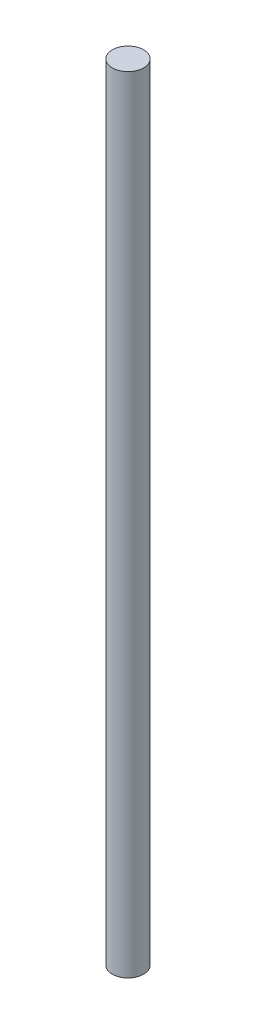
ISO-10303-21;
HEADER;
FILE_DESCRIPTION(('STEP AP214'),'2;1');
FILE_NAME('part.step','',(''),(''),'','','');
FILE_SCHEMA(('AUTOMOTIVE_DESIGN { 1 0 10303 214 1 1 1 1 }'));
ENDSEC;
DATA;
#1=APPLICATION_CONTEXT('core data for automotive mechanical design processes');
#2=APPLICATION_PROTOCOL_DEFINITION('international standard','automotive_design',2000,#1);
#3=PRODUCT_CONTEXT('',#1,'mechanical');
#4=PRODUCT('Part','Part','',(#3));
#5=PRODUCT_RELATED_PRODUCT_CATEGORY('part','',(#4));
#6=PRODUCT_DEFINITION_FORMATION('','',#4);
#7=PRODUCT_DEFINITION_CONTEXT('part definition',#1,'design');
#8=PRODUCT_DEFINITION('design','',#6,#7);
#9=PRODUCT_DEFINITION_SHAPE('','',#8);
#10=(LENGTH_UNIT() NAMED_UNIT(*) SI_UNIT(.MILLI.,.METRE.));
#11=(NAMED_UNIT(*) PLANE_ANGLE_UNIT() SI_UNIT($,.RADIAN.));
#12=(NAMED_UNIT(*) SI_UNIT($,.STERADIAN.) SOLID_ANGLE_UNIT());
#13=UNCERTAINTY_MEASURE_WITH_UNIT(LENGTH_MEASURE(1.E-05),#10,'distance_accuracy_value','');
#14=(GEOMETRIC_REPRESENTATION_CONTEXT(3) GLOBAL_UNCERTAINTY_ASSIGNED_CONTEXT((#13)) GLOBAL_UNIT_ASSIGNED_CONTEXT((#10,
#11,#12)) REPRESENTATION_CONTEXT('',''));
#15=CARTESIAN_POINT('',(0.,0.,0.));
#16=DIRECTION('',(0.,0.,1.));
#17=DIRECTION('',(1.,0.,0.));
#18=AXIS2_PLACEMENT_3D('',#15,#16,#17);
#19=CARTESIAN_POINT('',(0.,100.,0.));
#20=DIRECTION('',(0.,-1.,0.));
#21=DIRECTION('',(0.,0.,-1.));
#22=AXIS2_PLACEMENT_3D('',#19,#20,#21);
#23=CYLINDRICAL_SURFACE('',#22,2.);
#24=CARTESIAN_POINT('',(0.,100.,0.));
#25=DIRECTION('',(0.,1.,0.));
#26=DIRECTION('',(0.,0.,1.));
#27=AXIS2_PLACEMENT_3D('',#24,#25,#26);
#28=CIRCLE('',#27,2.);
#29=CARTESIAN_POINT('',(0.,100.,2.));
#30=VERTEX_POINT('',#29);
#31=EDGE_CURVE('E10',#30,#30,#28,.T.);
#32=ORIENTED_EDGE('',*,*,#31,.F.);
#33=EDGE_LOOP('',(#32));
#34=FACE_BOUND('',#33,.T.);
#35=CARTESIAN_POINT('',(0.,0.,0.));
#36=DIRECTION('',(0.,1.,0.));
#37=DIRECTION('',(0.,0.,1.));
#38=AXIS2_PLACEMENT_3D('',#35,#36,#37);
#39=CIRCLE('',#38,2.);
#40=CARTESIAN_POINT('',(0.,0.,2.));
#41=VERTEX_POINT('',#40);
#42=EDGE_CURVE('E37',#41,#41,#39,.T.);
#43=ORIENTED_EDGE('',*,*,#42,.T.);
#44=EDGE_LOOP('',(#43));
#45=FACE_BOUND('',#44,.T.);
#46=ADVANCED_FACE('F34',(#34,#45),#23,.T.);
#47=CARTESIAN_POINT('',(0.,100.,0.));
#48=DIRECTION('',(0.,1.,0.));
#49=DIRECTION('',(0.,0.,1.));
#50=AXIS2_PLACEMENT_3D('',#47,#48,#49);
#51=PLANE('',#50);
#52=ORIENTED_EDGE('',*,*,#31,.T.);
#53=EDGE_LOOP('',(#52));
#54=FACE_BOUND('',#53,.T.);
#55=ADVANCED_FACE('F49',(#54),#51,.T.);
#56=CARTESIAN_POINT('',(0.,0.,0.));
#57=DIRECTION('',(0.,1.,0.));
#58=DIRECTION('',(0.,0.,1.));
#59=AXIS2_PLACEMENT_3D('',#56,#57,#58);
#60=PLANE('',#59);
#61=ORIENTED_EDGE('',*,*,#42,.F.);
#62=EDGE_LOOP('',(#61));
#63=FACE_BOUND('',#62,.T.);
#64=ADVANCED_FACE('F47',(#63),#60,.F.);
#65=CLOSED_SHELL('',(#46,#55,#64));
#66=MANIFOLD_SOLID_BREP('B2',#65);
#67=ADVANCED_BREP_SHAPE_REPRESENTATION('',(#18,#66),#14);
#68=SHAPE_DEFINITION_REPRESENTATION(#9,#67);
ENDSEC;
END-ISO-10303-21;
